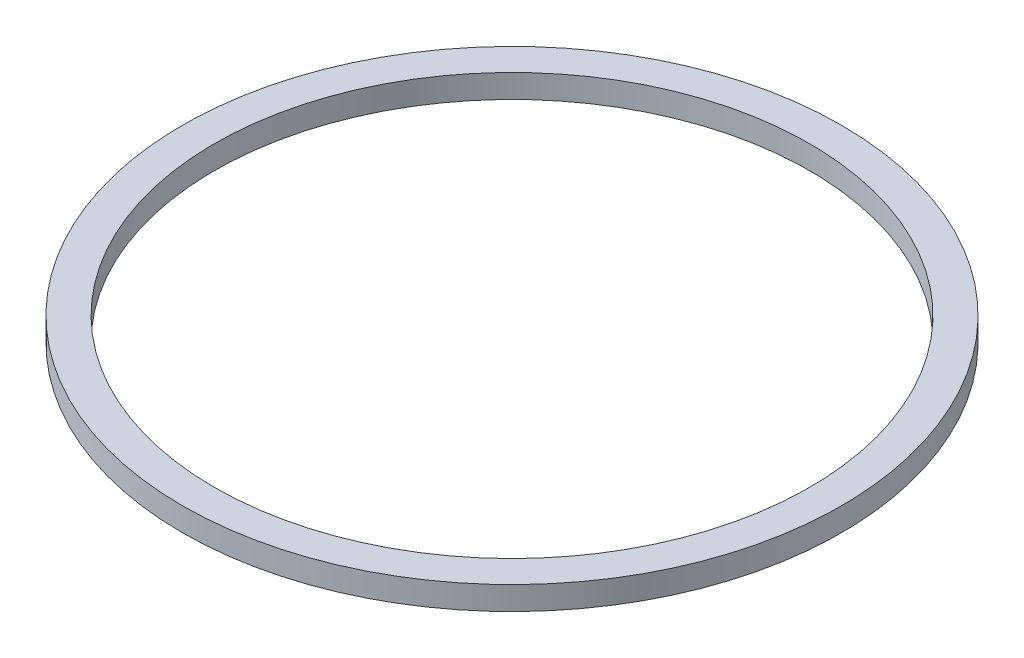
ISO-10303-21;
HEADER;
FILE_DESCRIPTION(('STEP AP214'),'2;1');
FILE_NAME('part.step','',(''),(''),'','','');
FILE_SCHEMA(('AUTOMOTIVE_DESIGN { 1 0 10303 214 1 1 1 1 }'));
ENDSEC;
DATA;
#1=APPLICATION_CONTEXT('core data for automotive mechanical design processes');
#2=APPLICATION_PROTOCOL_DEFINITION('international standard','automotive_design',2000,#1);
#3=PRODUCT_CONTEXT('',#1,'mechanical');
#4=PRODUCT('Part','Part','',(#3));
#5=PRODUCT_RELATED_PRODUCT_CATEGORY('part','',(#4));
#6=PRODUCT_DEFINITION_FORMATION('','',#4);
#7=PRODUCT_DEFINITION_CONTEXT('part definition',#1,'design');
#8=PRODUCT_DEFINITION('design','',#6,#7);
#9=PRODUCT_DEFINITION_SHAPE('','',#8);
#10=(LENGTH_UNIT() NAMED_UNIT(*) SI_UNIT(.MILLI.,.METRE.));
#11=(NAMED_UNIT(*) PLANE_ANGLE_UNIT() SI_UNIT($,.RADIAN.));
#12=(NAMED_UNIT(*) SI_UNIT($,.STERADIAN.) SOLID_ANGLE_UNIT());
#13=UNCERTAINTY_MEASURE_WITH_UNIT(LENGTH_MEASURE(1.E-05),#10,'distance_accuracy_value','');
#14=(GEOMETRIC_REPRESENTATION_CONTEXT(3) GLOBAL_UNCERTAINTY_ASSIGNED_CONTEXT((#13)) GLOBAL_UNIT_ASSIGNED_CONTEXT((#10,
#11,#12)) REPRESENTATION_CONTEXT('',''));
#15=CARTESIAN_POINT('',(0.,0.,0.));
#16=DIRECTION('',(0.,0.,1.));
#17=DIRECTION('',(1.,0.,0.));
#18=AXIS2_PLACEMENT_3D('',#15,#16,#17);
#19=CARTESIAN_POINT('',(0.,1.1,0.));
#20=DIRECTION('',(0.,1.,0.));
#21=DIRECTION('',(0.,0.,1.));
#22=AXIS2_PLACEMENT_3D('',#19,#20,#21);
#23=PLANE('',#22);
#24=CARTESIAN_POINT('',(0.,1.1,0.));
#25=DIRECTION('',(0.,1.,0.));
#26=DIRECTION('',(0.,0.,1.));
#27=AXIS2_PLACEMENT_3D('',#24,#25,#26);
#28=CIRCLE('',#27,15.5);
#29=CARTESIAN_POINT('',(0.,1.1,15.5));
#30=VERTEX_POINT('',#29);
#31=EDGE_CURVE('E10',#30,#30,#28,.T.);
#32=ORIENTED_EDGE('',*,*,#31,.T.);
#33=EDGE_LOOP('',(#32));
#34=FACE_BOUND('',#33,.T.);
#35=CARTESIAN_POINT('',(0.,1.1,0.));
#36=DIRECTION('',(0.,1.,0.));
#37=DIRECTION('',(0.,0.,1.));
#38=AXIS2_PLACEMENT_3D('',#35,#36,#37);
#39=CIRCLE('',#38,14.);
#40=CARTESIAN_POINT('',(0.,1.1,14.));
#41=VERTEX_POINT('',#40);
#42=EDGE_CURVE('E42',#41,#41,#39,.T.);
#43=ORIENTED_EDGE('',*,*,#42,.F.);
#44=EDGE_LOOP('',(#43));
#45=FACE_BOUND('',#44,.T.);
#46=ADVANCED_FACE('F31',(#34,#45),#23,.T.);
#47=CARTESIAN_POINT('',(0.,0.,0.));
#48=DIRECTION('',(0.,1.,0.));
#49=DIRECTION('',(0.,0.,1.));
#50=AXIS2_PLACEMENT_3D('',#47,#48,#49);
#51=PLANE('',#50);
#52=CARTESIAN_POINT('',(0.,0.,0.));
#53=DIRECTION('',(0.,1.,0.));
#54=DIRECTION('',(0.,0.,1.));
#55=AXIS2_PLACEMENT_3D('',#52,#53,#54);
#56=CIRCLE('',#55,15.5);
#57=CARTESIAN_POINT('',(0.,0.,15.5));
#58=VERTEX_POINT('',#57);
#59=EDGE_CURVE('E35',#58,#58,#56,.T.);
#60=ORIENTED_EDGE('',*,*,#59,.F.);
#61=EDGE_LOOP('',(#60));
#62=FACE_BOUND('',#61,.T.);
#63=CARTESIAN_POINT('',(0.,0.,0.));
#64=DIRECTION('',(0.,1.,0.));
#65=DIRECTION('',(0.,0.,1.));
#66=AXIS2_PLACEMENT_3D('',#63,#64,#65);
#67=CIRCLE('',#66,14.);
#68=CARTESIAN_POINT('',(0.,0.,14.));
#69=VERTEX_POINT('',#68);
#70=EDGE_CURVE('E44',#69,#69,#67,.T.);
#71=ORIENTED_EDGE('',*,*,#70,.T.);
#72=EDGE_LOOP('',(#71));
#73=FACE_BOUND('',#72,.T.);
#74=ADVANCED_FACE('F54',(#62,#73),#51,.F.);
#75=CARTESIAN_POINT('',(0.,1.1,0.));
#76=DIRECTION('',(0.,-1.,0.));
#77=DIRECTION('',(0.,0.,-1.));
#78=AXIS2_PLACEMENT_3D('',#75,#76,#77);
#79=CYLINDRICAL_SURFACE('',#78,15.5);
#80=ORIENTED_EDGE('',*,*,#31,.F.);
#81=EDGE_LOOP('',(#80));
#82=FACE_BOUND('',#81,.T.);
#83=ORIENTED_EDGE('',*,*,#59,.T.);
#84=EDGE_LOOP('',(#83));
#85=FACE_BOUND('',#84,.T.);
#86=ADVANCED_FACE('F33',(#82,#85),#79,.T.);
#87=CARTESIAN_POINT('',(0.,1.1,0.));
#88=DIRECTION('',(0.,-1.,0.));
#89=DIRECTION('',(0.,0.,-1.));
#90=AXIS2_PLACEMENT_3D('',#87,#88,#89);
#91=CYLINDRICAL_SURFACE('',#90,14.);
#92=ORIENTED_EDGE('',*,*,#42,.T.);
#93=EDGE_LOOP('',(#92));
#94=FACE_BOUND('',#93,.T.);
#95=ORIENTED_EDGE('',*,*,#70,.F.);
#96=EDGE_LOOP('',(#95));
#97=FACE_BOUND('',#96,.T.);
#98=ADVANCED_FACE('F50',(#94,#97),#91,.F.);
#99=CLOSED_SHELL('',(#46,#74,#86,#98));
#100=MANIFOLD_SOLID_BREP('B2',#99);
#101=ADVANCED_BREP_SHAPE_REPRESENTATION('',(#18,#100),#14);
#102=SHAPE_DEFINITION_REPRESENTATION(#9,#101);
ENDSEC;
END-ISO-10303-21;
